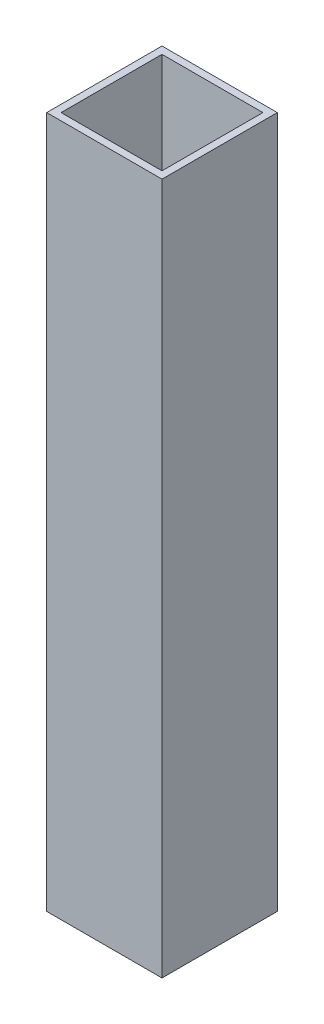
ISO-10303-21;
HEADER;
FILE_DESCRIPTION(('STEP AP214'),'2;1');
FILE_NAME('part.step','',(''),(''),'','','');
FILE_SCHEMA(('AUTOMOTIVE_DESIGN { 1 0 10303 214 1 1 1 1 }'));
ENDSEC;
DATA;
#1=APPLICATION_CONTEXT('core data for automotive mechanical design processes');
#2=APPLICATION_PROTOCOL_DEFINITION('international standard','automotive_design',2000,#1);
#3=PRODUCT_CONTEXT('',#1,'mechanical');
#4=PRODUCT('Part','Part','',(#3));
#5=PRODUCT_RELATED_PRODUCT_CATEGORY('part','',(#4));
#6=PRODUCT_DEFINITION_FORMATION('','',#4);
#7=PRODUCT_DEFINITION_CONTEXT('part definition',#1,'design');
#8=PRODUCT_DEFINITION('design','',#6,#7);
#9=PRODUCT_DEFINITION_SHAPE('','',#8);
#10=(LENGTH_UNIT() NAMED_UNIT(*) SI_UNIT(.MILLI.,.METRE.));
#11=(NAMED_UNIT(*) PLANE_ANGLE_UNIT() SI_UNIT($,.RADIAN.));
#12=(NAMED_UNIT(*) SI_UNIT($,.STERADIAN.) SOLID_ANGLE_UNIT());
#13=UNCERTAINTY_MEASURE_WITH_UNIT(LENGTH_MEASURE(1.E-05),#10,'distance_accuracy_value','');
#14=(GEOMETRIC_REPRESENTATION_CONTEXT(3) GLOBAL_UNCERTAINTY_ASSIGNED_CONTEXT((#13)) GLOBAL_UNIT_ASSIGNED_CONTEXT((#10,
#11,#12)) REPRESENTATION_CONTEXT('',''));
#15=CARTESIAN_POINT('',(0.,0.,0.));
#16=DIRECTION('',(0.,0.,1.));
#17=DIRECTION('',(1.,0.,0.));
#18=AXIS2_PLACEMENT_3D('',#15,#16,#17);
#19=CARTESIAN_POINT('',(0.,152.4,0.));
#20=DIRECTION('',(0.,-1.,0.));
#21=DIRECTION('',(0.,0.,-1.));
#22=AXIS2_PLACEMENT_3D('',#19,#20,#21);
#23=PLANE('',#22);
#24=DIRECTION('',(0.,0.,1.));
#25=VECTOR('',#24,1.);
#26=CARTESIAN_POINT('',(-12.7,152.4,-12.7));
#27=LINE('',#26,#25);
#28=CARTESIAN_POINT('',(-12.7,152.4,-12.7));
#29=VERTEX_POINT('',#28);
#30=CARTESIAN_POINT('',(-12.7,152.4,12.7));
#31=VERTEX_POINT('',#30);
#32=EDGE_CURVE('E134',#29,#31,#27,.T.);
#33=ORIENTED_EDGE('',*,*,#32,.T.);
#34=DIRECTION('',(1.,0.,0.));
#35=VECTOR('',#34,1.);
#36=CARTESIAN_POINT('',(12.7,152.4,12.7));
#37=LINE('',#36,#35);
#38=CARTESIAN_POINT('',(12.7,152.4,12.7));
#39=VERTEX_POINT('',#38);
#40=EDGE_CURVE('E137',#31,#39,#37,.T.);
#41=ORIENTED_EDGE('',*,*,#40,.T.);
#42=DIRECTION('',(0.,0.,-1.));
#43=VECTOR('',#42,1.);
#44=CARTESIAN_POINT('',(12.7,152.4,-12.7));
#45=LINE('',#44,#43);
#46=CARTESIAN_POINT('',(12.7,152.4,-12.7));
#47=VERTEX_POINT('',#46);
#48=EDGE_CURVE('E140',#39,#47,#45,.T.);
#49=ORIENTED_EDGE('',*,*,#48,.T.);
#50=DIRECTION('',(-1.,0.,0.));
#51=VECTOR('',#50,1.);
#52=CARTESIAN_POINT('',(12.7,152.4,-12.7));
#53=LINE('',#52,#51);
#54=EDGE_CURVE('E142',#47,#29,#53,.T.);
#55=ORIENTED_EDGE('',*,*,#54,.T.);
#56=EDGE_LOOP('',(#33,#41,#49,#55));
#57=FACE_BOUND('',#56,.T.);
#58=DIRECTION('',(0.,0.,-1.));
#59=VECTOR('',#58,1.);
#60=CARTESIAN_POINT('',(11.1125,152.4,11.1125));
#61=LINE('',#60,#59);
#62=CARTESIAN_POINT('',(11.1125,152.4,11.1125));
#63=VERTEX_POINT('',#62);
#64=CARTESIAN_POINT('',(11.1125,152.4,-11.1125));
#65=VERTEX_POINT('',#64);
#66=EDGE_CURVE('E98',#63,#65,#61,.T.);
#67=ORIENTED_EDGE('',*,*,#66,.F.);
#68=DIRECTION('',(1.,0.,0.));
#69=VECTOR('',#68,1.);
#70=CARTESIAN_POINT('',(-11.1125,152.4,11.1125));
#71=LINE('',#70,#69);
#72=CARTESIAN_POINT('',(-11.1125,152.4,11.1125));
#73=VERTEX_POINT('',#72);
#74=EDGE_CURVE('E120',#73,#63,#71,.T.);
#75=ORIENTED_EDGE('',*,*,#74,.F.);
#76=DIRECTION('',(0.,0.,1.));
#77=VECTOR('',#76,1.);
#78=CARTESIAN_POINT('',(-11.1125,152.4,11.1125));
#79=LINE('',#78,#77);
#80=CARTESIAN_POINT('',(-11.1125,152.4,-11.1125));
#81=VERTEX_POINT('',#80);
#82=EDGE_CURVE('E118',#81,#73,#79,.T.);
#83=ORIENTED_EDGE('',*,*,#82,.F.);
#84=DIRECTION('',(-1.,0.,0.));
#85=VECTOR('',#84,1.);
#86=CARTESIAN_POINT('',(-11.1125,152.4,-11.1125));
#87=LINE('',#86,#85);
#88=EDGE_CURVE('E106',#65,#81,#87,.T.);
#89=ORIENTED_EDGE('',*,*,#88,.F.);
#90=EDGE_LOOP('',(#67,#75,#83,#89));
#91=FACE_BOUND('',#90,.T.);
#92=ADVANCED_FACE('F33',(#57,#91),#23,.F.);
#93=CARTESIAN_POINT('',(0.,0.,0.));
#94=DIRECTION('',(0.,-1.,0.));
#95=DIRECTION('',(0.,0.,-1.));
#96=AXIS2_PLACEMENT_3D('',#93,#94,#95);
#97=PLANE('',#96);
#98=DIRECTION('',(0.,0.,1.));
#99=VECTOR('',#98,1.);
#100=CARTESIAN_POINT('',(-12.7,0.,-12.7));
#101=LINE('',#100,#99);
#102=CARTESIAN_POINT('',(-12.7,0.,-12.7));
#103=VERTEX_POINT('',#102);
#104=CARTESIAN_POINT('',(-12.7,0.,12.7));
#105=VERTEX_POINT('',#104);
#106=EDGE_CURVE('E114',#103,#105,#101,.T.);
#107=ORIENTED_EDGE('',*,*,#106,.F.);
#108=DIRECTION('',(-1.,0.,0.));
#109=VECTOR('',#108,1.);
#110=CARTESIAN_POINT('',(12.7,0.,-12.7));
#111=LINE('',#110,#109);
#112=CARTESIAN_POINT('',(12.7,0.,-12.7));
#113=VERTEX_POINT('',#112);
#114=EDGE_CURVE('E138',#113,#103,#111,.T.);
#115=ORIENTED_EDGE('',*,*,#114,.F.);
#116=DIRECTION('',(0.,0.,-1.));
#117=VECTOR('',#116,1.);
#118=CARTESIAN_POINT('',(12.7,0.,-12.7));
#119=LINE('',#118,#117);
#120=CARTESIAN_POINT('',(12.7,0.,12.7));
#121=VERTEX_POINT('',#120);
#122=EDGE_CURVE('E149',#121,#113,#119,.T.);
#123=ORIENTED_EDGE('',*,*,#122,.F.);
#124=DIRECTION('',(1.,0.,0.));
#125=VECTOR('',#124,1.);
#126=CARTESIAN_POINT('',(12.7,0.,12.7));
#127=LINE('',#126,#125);
#128=EDGE_CURVE('E147',#105,#121,#127,.T.);
#129=ORIENTED_EDGE('',*,*,#128,.F.);
#130=EDGE_LOOP('',(#107,#115,#123,#129));
#131=FACE_BOUND('',#130,.T.);
#132=DIRECTION('',(1.,0.,0.));
#133=VECTOR('',#132,1.);
#134=CARTESIAN_POINT('',(-11.1125,0.,11.1125));
#135=LINE('',#134,#133);
#136=CARTESIAN_POINT('',(-11.1125,0.,11.1125));
#137=VERTEX_POINT('',#136);
#138=CARTESIAN_POINT('',(11.1125,0.,11.1125));
#139=VERTEX_POINT('',#138);
#140=EDGE_CURVE('E107',#137,#139,#135,.T.);
#141=ORIENTED_EDGE('',*,*,#140,.T.);
#142=DIRECTION('',(0.,0.,-1.));
#143=VECTOR('',#142,1.);
#144=CARTESIAN_POINT('',(11.1125,0.,11.1125));
#145=LINE('',#144,#143);
#146=CARTESIAN_POINT('',(11.1125,0.,-11.1125));
#147=VERTEX_POINT('',#146);
#148=EDGE_CURVE('E56',#139,#147,#145,.T.);
#149=ORIENTED_EDGE('',*,*,#148,.T.);
#150=DIRECTION('',(-1.,0.,0.));
#151=VECTOR('',#150,1.);
#152=CARTESIAN_POINT('',(-11.1125,0.,-11.1125));
#153=LINE('',#152,#151);
#154=CARTESIAN_POINT('',(-11.1125,0.,-11.1125));
#155=VERTEX_POINT('',#154);
#156=EDGE_CURVE('E113',#147,#155,#153,.T.);
#157=ORIENTED_EDGE('',*,*,#156,.T.);
#158=DIRECTION('',(0.,0.,1.));
#159=VECTOR('',#158,1.);
#160=CARTESIAN_POINT('',(-11.1125,0.,11.1125));
#161=LINE('',#160,#159);
#162=EDGE_CURVE('E126',#155,#137,#161,.T.);
#163=ORIENTED_EDGE('',*,*,#162,.T.);
#164=EDGE_LOOP('',(#141,#149,#157,#163));
#165=FACE_BOUND('',#164,.T.);
#166=ADVANCED_FACE('F167',(#131,#165),#97,.T.);
#167=CARTESIAN_POINT('',(-12.7,152.4,-12.7));
#168=DIRECTION('',(1.,0.,0.));
#169=DIRECTION('',(0.,0.,-1.));
#170=AXIS2_PLACEMENT_3D('',#167,#168,#169);
#171=PLANE('',#170);
#172=ORIENTED_EDGE('',*,*,#106,.T.);
#173=DIRECTION('',(0.,-1.,0.));
#174=VECTOR('',#173,1.);
#175=CARTESIAN_POINT('',(-12.7,152.4,12.7));
#176=LINE('',#175,#174);
#177=EDGE_CURVE('E11',#31,#105,#176,.T.);
#178=ORIENTED_EDGE('',*,*,#177,.F.);
#179=ORIENTED_EDGE('',*,*,#32,.F.);
#180=DIRECTION('',(0.,-1.,0.));
#181=VECTOR('',#180,1.);
#182=CARTESIAN_POINT('',(-12.7,152.4,-12.7));
#183=LINE('',#182,#181);
#184=EDGE_CURVE('E144',#29,#103,#183,.T.);
#185=ORIENTED_EDGE('',*,*,#184,.T.);
#186=EDGE_LOOP('',(#172,#178,#179,#185));
#187=FACE_BOUND('',#186,.T.);
#188=ADVANCED_FACE('F35',(#187),#171,.F.);
#189=CARTESIAN_POINT('',(12.7,152.4,12.7));
#190=DIRECTION('',(0.,0.,-1.));
#191=DIRECTION('',(-1.,0.,0.));
#192=AXIS2_PLACEMENT_3D('',#189,#190,#191);
#193=PLANE('',#192);
#194=ORIENTED_EDGE('',*,*,#128,.T.);
#195=DIRECTION('',(0.,-1.,0.));
#196=VECTOR('',#195,1.);
#197=CARTESIAN_POINT('',(12.7,152.4,12.7));
#198=LINE('',#197,#196);
#199=EDGE_CURVE('E41',#39,#121,#198,.T.);
#200=ORIENTED_EDGE('',*,*,#199,.F.);
#201=ORIENTED_EDGE('',*,*,#40,.F.);
#202=ORIENTED_EDGE('',*,*,#177,.T.);
#203=EDGE_LOOP('',(#194,#200,#201,#202));
#204=FACE_BOUND('',#203,.T.);
#205=ADVANCED_FACE('F177',(#204),#193,.F.);
#206=CARTESIAN_POINT('',(12.7,152.4,-12.7));
#207=DIRECTION('',(-1.,0.,0.));
#208=DIRECTION('',(0.,0.,1.));
#209=AXIS2_PLACEMENT_3D('',#206,#207,#208);
#210=PLANE('',#209);
#211=ORIENTED_EDGE('',*,*,#122,.T.);
#212=DIRECTION('',(0.,-1.,0.));
#213=VECTOR('',#212,1.);
#214=CARTESIAN_POINT('',(12.7,152.4,-12.7));
#215=LINE('',#214,#213);
#216=EDGE_CURVE('E154',#47,#113,#215,.T.);
#217=ORIENTED_EDGE('',*,*,#216,.F.);
#218=ORIENTED_EDGE('',*,*,#48,.F.);
#219=ORIENTED_EDGE('',*,*,#199,.T.);
#220=EDGE_LOOP('',(#211,#217,#218,#219));
#221=FACE_BOUND('',#220,.T.);
#222=ADVANCED_FACE('F161',(#221),#210,.F.);
#223=CARTESIAN_POINT('',(12.7,152.4,-12.7));
#224=DIRECTION('',(0.,0.,1.));
#225=DIRECTION('',(1.,0.,0.));
#226=AXIS2_PLACEMENT_3D('',#223,#224,#225);
#227=PLANE('',#226);
#228=ORIENTED_EDGE('',*,*,#114,.T.);
#229=ORIENTED_EDGE('',*,*,#184,.F.);
#230=ORIENTED_EDGE('',*,*,#54,.F.);
#231=ORIENTED_EDGE('',*,*,#216,.T.);
#232=EDGE_LOOP('',(#228,#229,#230,#231));
#233=FACE_BOUND('',#232,.T.);
#234=ADVANCED_FACE('F171',(#233),#227,.F.);
#235=CARTESIAN_POINT('',(11.1125,152.4,11.1125));
#236=DIRECTION('',(-1.,0.,0.));
#237=DIRECTION('',(0.,0.,1.));
#238=AXIS2_PLACEMENT_3D('',#235,#236,#237);
#239=PLANE('',#238);
#240=ORIENTED_EDGE('',*,*,#148,.F.);
#241=DIRECTION('',(0.,-1.,0.));
#242=VECTOR('',#241,1.);
#243=CARTESIAN_POINT('',(11.1125,152.4,11.1125));
#244=LINE('',#243,#242);
#245=EDGE_CURVE('E102',#63,#139,#244,.T.);
#246=ORIENTED_EDGE('',*,*,#245,.F.);
#247=ORIENTED_EDGE('',*,*,#66,.T.);
#248=DIRECTION('',(0.,-1.,0.));
#249=VECTOR('',#248,1.);
#250=CARTESIAN_POINT('',(11.1125,152.4,-11.1125));
#251=LINE('',#250,#249);
#252=EDGE_CURVE('E101',#65,#147,#251,.T.);
#253=ORIENTED_EDGE('',*,*,#252,.T.);
#254=EDGE_LOOP('',(#240,#246,#247,#253));
#255=FACE_BOUND('',#254,.T.);
#256=ADVANCED_FACE('F100',(#255),#239,.T.);
#257=CARTESIAN_POINT('',(-11.1125,152.4,-11.1125));
#258=DIRECTION('',(0.,0.,1.));
#259=DIRECTION('',(1.,0.,0.));
#260=AXIS2_PLACEMENT_3D('',#257,#258,#259);
#261=PLANE('',#260);
#262=ORIENTED_EDGE('',*,*,#156,.F.);
#263=ORIENTED_EDGE('',*,*,#252,.F.);
#264=ORIENTED_EDGE('',*,*,#88,.T.);
#265=DIRECTION('',(0.,-1.,0.));
#266=VECTOR('',#265,1.);
#267=CARTESIAN_POINT('',(-11.1125,152.4,-11.1125));
#268=LINE('',#267,#266);
#269=EDGE_CURVE('E115',#81,#155,#268,.T.);
#270=ORIENTED_EDGE('',*,*,#269,.T.);
#271=EDGE_LOOP('',(#262,#263,#264,#270));
#272=FACE_BOUND('',#271,.T.);
#273=ADVANCED_FACE('F110',(#272),#261,.T.);
#274=CARTESIAN_POINT('',(-11.1125,152.4,11.1125));
#275=DIRECTION('',(1.,0.,0.));
#276=DIRECTION('',(0.,0.,-1.));
#277=AXIS2_PLACEMENT_3D('',#274,#275,#276);
#278=PLANE('',#277);
#279=ORIENTED_EDGE('',*,*,#162,.F.);
#280=ORIENTED_EDGE('',*,*,#269,.F.);
#281=ORIENTED_EDGE('',*,*,#82,.T.);
#282=DIRECTION('',(0.,-1.,0.));
#283=VECTOR('',#282,1.);
#284=CARTESIAN_POINT('',(-11.1125,152.4,11.1125));
#285=LINE('',#284,#283);
#286=EDGE_CURVE('E48',#73,#137,#285,.T.);
#287=ORIENTED_EDGE('',*,*,#286,.T.);
#288=EDGE_LOOP('',(#279,#280,#281,#287));
#289=FACE_BOUND('',#288,.T.);
#290=ADVANCED_FACE('F200',(#289),#278,.T.);
#291=CARTESIAN_POINT('',(-11.1125,152.4,11.1125));
#292=DIRECTION('',(0.,0.,-1.));
#293=DIRECTION('',(-1.,0.,0.));
#294=AXIS2_PLACEMENT_3D('',#291,#292,#293);
#295=PLANE('',#294);
#296=ORIENTED_EDGE('',*,*,#140,.F.);
#297=ORIENTED_EDGE('',*,*,#286,.F.);
#298=ORIENTED_EDGE('',*,*,#74,.T.);
#299=ORIENTED_EDGE('',*,*,#245,.T.);
#300=EDGE_LOOP('',(#296,#297,#298,#299));
#301=FACE_BOUND('',#300,.T.);
#302=ADVANCED_FACE('F204',(#301),#295,.T.);
#303=CLOSED_SHELL('',(#92,#166,#188,#205,#222,#234,#256,#273,#290,#302));
#304=MANIFOLD_SOLID_BREP('B2',#303);
#305=ADVANCED_BREP_SHAPE_REPRESENTATION('',(#18,#304),#14);
#306=SHAPE_DEFINITION_REPRESENTATION(#9,#305);
ENDSEC;
END-ISO-10303-21;
